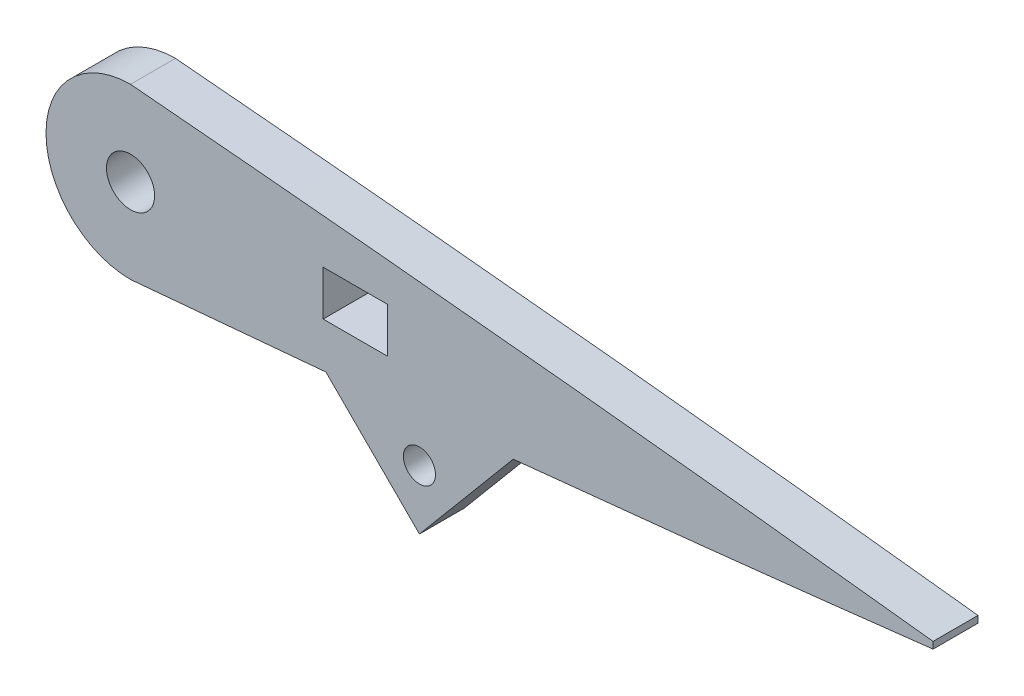
ISO-10303-21;
HEADER;
FILE_DESCRIPTION(('STEP AP214'),'2;1');
FILE_NAME('part.step','',(''),(''),'','','');
FILE_SCHEMA(('AUTOMOTIVE_DESIGN { 1 0 10303 214 1 1 1 1 }'));
ENDSEC;
DATA;
#1=APPLICATION_CONTEXT('core data for automotive mechanical design processes');
#2=APPLICATION_PROTOCOL_DEFINITION('international standard','automotive_design',2000,#1);
#3=PRODUCT_CONTEXT('',#1,'mechanical');
#4=PRODUCT('Part','Part','',(#3));
#5=PRODUCT_RELATED_PRODUCT_CATEGORY('part','',(#4));
#6=PRODUCT_DEFINITION_FORMATION('','',#4);
#7=PRODUCT_DEFINITION_CONTEXT('part definition',#1,'design');
#8=PRODUCT_DEFINITION('design','',#6,#7);
#9=PRODUCT_DEFINITION_SHAPE('','',#8);
#10=(LENGTH_UNIT() NAMED_UNIT(*) SI_UNIT(.MILLI.,.METRE.));
#11=(NAMED_UNIT(*) PLANE_ANGLE_UNIT() SI_UNIT($,.RADIAN.));
#12=(NAMED_UNIT(*) SI_UNIT($,.STERADIAN.) SOLID_ANGLE_UNIT());
#13=UNCERTAINTY_MEASURE_WITH_UNIT(LENGTH_MEASURE(1.E-05),#10,'distance_accuracy_value','');
#14=(GEOMETRIC_REPRESENTATION_CONTEXT(3) GLOBAL_UNCERTAINTY_ASSIGNED_CONTEXT((#13)) GLOBAL_UNIT_ASSIGNED_CONTEXT((#10,
#11,#12)) REPRESENTATION_CONTEXT('',''));
#15=CARTESIAN_POINT('',(0.,0.,0.));
#16=DIRECTION('',(0.,0.,1.));
#17=DIRECTION('',(1.,0.,0.));
#18=AXIS2_PLACEMENT_3D('',#15,#16,#17);
#19=CARTESIAN_POINT('',(103.510485688962,-86.8556103645885,1.4));
#20=DIRECTION('',(-0.766044443118982,0.642787609686535,0.));
#21=DIRECTION('',(-0.642787609686535,-0.766044443118982,0.));
#22=AXIS2_PLACEMENT_3D('',#19,#20,#21);
#23=PLANE('',#22);
#24=DIRECTION('',(0.642787609686535,0.766044443118982,0.));
#25=VECTOR('',#24,1.);
#26=CARTESIAN_POINT('',(103.510485688962,-86.8556103645885,-1.4));
#27=LINE('',#26,#25);
#28=CARTESIAN_POINT('',(167.999999999793,-9.99999999999999,-1.4));
#29=VERTEX_POINT('',#28);
#30=CARTESIAN_POINT('',(173.839461144014,-3.0408012025597,-1.4));
#31=VERTEX_POINT('',#30);
#32=EDGE_CURVE('E269',#29,#31,#27,.T.);
#33=ORIENTED_EDGE('',*,*,#32,.T.);
#34=DIRECTION('',(0.,0.,-1.));
#35=VECTOR('',#34,1.);
#36=CARTESIAN_POINT('',(173.839461144014,-3.0408012025597,1.4));
#37=LINE('',#36,#35);
#38=CARTESIAN_POINT('',(173.839461144014,-3.0408012025597,1.4));
#39=VERTEX_POINT('',#38);
#40=EDGE_CURVE('E11',#39,#31,#37,.T.);
#41=ORIENTED_EDGE('',*,*,#40,.F.);
#42=DIRECTION('',(0.642787609686535,0.766044443118982,0.));
#43=VECTOR('',#42,1.);
#44=CARTESIAN_POINT('',(103.510485688962,-86.8556103645885,1.4));
#45=LINE('',#44,#43);
#46=CARTESIAN_POINT('',(167.999999999793,-9.99999999999999,1.4));
#47=VERTEX_POINT('',#46);
#48=EDGE_CURVE('E204',#47,#39,#45,.T.);
#49=ORIENTED_EDGE('',*,*,#48,.F.);
#50=DIRECTION('',(0.,0.,-1.));
#51=VECTOR('',#50,1.);
#52=CARTESIAN_POINT('',(167.999999999793,-9.99999999999999,1.4));
#53=LINE('',#52,#51);
#54=EDGE_CURVE('E306',#47,#29,#53,.T.);
#55=ORIENTED_EDGE('',*,*,#54,.T.);
#56=EDGE_LOOP('',(#33,#41,#49,#55));
#57=FACE_BOUND('',#56,.T.);
#58=ADVANCED_FACE('F41',(#57),#23,.F.);
#59=CARTESIAN_POINT('',(0.,0.,1.4));
#60=CARTESIAN_POINT('',(0.032444912785252,-0.278495811932672,1.4));
#61=CARTESIAN_POINT('',(0.100633197622265,-0.863800259371728,1.4));
#62=CARTESIAN_POINT('',(0.623792519502603,-1.67890559775423,1.4));
#63=CARTESIAN_POINT('',(1.40745451828777,-2.44535909768092,1.4));
#64=CARTESIAN_POINT('',(2.48215990999626,-3.17800751475483,1.4));
#65=CARTESIAN_POINT('',(3.83151572514316,-3.88154027980952,1.4));
#66=CARTESIAN_POINT('',(5.4563996703271,-4.55654172443833,1.4));
#67=CARTESIAN_POINT('',(7.35019505624769,-5.20163810131563,1.4));
#68=CARTESIAN_POINT('',(9.50742603844495,-5.81478546001263,1.4));
#69=CARTESIAN_POINT('',(11.9213051192179,-6.39387938375779,1.4));
#70=CARTESIAN_POINT('',(14.5848929101615,-6.93661243110209,1.4));
#71=CARTESIAN_POINT('',(17.4908774412382,-7.44078362046572,1.4));
#72=CARTESIAN_POINT('',(20.6317189277736,-7.90429451896973,1.4));
#73=CARTESIAN_POINT('',(23.999672571568,-8.32520507104545,1.4));
#74=CARTESIAN_POINT('',(27.5867798768591,-8.70174184542543,1.4));
#75=CARTESIAN_POINT('',(31.3848698966528,-9.03247593180038,1.4));
#76=CARTESIAN_POINT('',(35.3855806534432,-9.31609287396642,1.4));
#77=CARTESIAN_POINT('',(39.5803132923038,-9.55173595460592,1.4));
#78=CARTESIAN_POINT('',(43.9602634342418,-9.73880703158846,1.4));
#79=CARTESIAN_POINT('',(48.5163740297902,-9.87706597159685,1.4));
#80=CARTESIAN_POINT('',(53.2393408892924,-9.96650447988356,1.4));
#81=CARTESIAN_POINT('',(58.1195804749707,-10.007674079145,1.4));
#82=CARTESIAN_POINT('',(63.1472322990156,-10.001179646896,1.4));
#83=CARTESIAN_POINT('',(68.3121128519377,-9.94818077935783,1.4));
#84=CARTESIAN_POINT('',(73.6037062020649,-9.8499841929222,1.4));
#85=CARTESIAN_POINT('',(79.0111217778761,-9.70818550815225,1.4));
#86=CARTESIAN_POINT('',(84.523090509599,-9.52465705063052,1.4));
#87=CARTESIAN_POINT('',(90.1278825022712,-9.30143328572871,1.4));
#88=CARTESIAN_POINT('',(95.8133076165863,-9.04071110478476,1.4));
#89=CARTESIAN_POINT('',(101.566628902932,-8.7448298081215,1.4));
#90=CARTESIAN_POINT('',(107.374551667041,-8.41626692508818,1.4));
#91=CARTESIAN_POINT('',(113.22310934854,-8.05749764662533,1.4));
#92=CARTESIAN_POINT('',(119.097620697921,-7.67114629363284,1.4));
#93=CARTESIAN_POINT('',(124.982562689731,-7.25984067879183,1.4));
#94=CARTESIAN_POINT('',(130.861479372453,-6.82616997050118,1.4));
#95=CARTESIAN_POINT('',(136.716836604175,-6.37289207616603,1.4));
#96=CARTESIAN_POINT('',(142.529855650017,-5.90276600308212,1.4));
#97=CARTESIAN_POINT('',(148.280267016593,-5.41860205745455,1.4));
#98=CARTESIAN_POINT('',(153.946093309733,-4.92342664586893,1.4));
#99=CARTESIAN_POINT('',(159.503224244657,-4.42043747597675,1.4));
#100=CARTESIAN_POINT('',(164.924982484319,-3.91321825677237,1.4));
#101=CARTESIAN_POINT('',(170.181418839819,-3.40569757505764,1.4));
#102=CARTESIAN_POINT('',(175.238405484524,-2.90257427967232,1.4));
#103=CARTESIAN_POINT('',(180.056168680252,-2.40924306336166,1.4));
#104=CARTESIAN_POINT('',(184.587045719794,-1.9324791813071,1.4));
#105=CARTESIAN_POINT('',(188.771568450786,-1.48069518196539,1.4));
#106=CARTESIAN_POINT('',(192.53078468655,-1.06506384171922,1.4));
#107=CARTESIAN_POINT('',(195.747560943775,-0.701689978749802,1.4));
#108=CARTESIAN_POINT('',(198.179524953216,-0.422303953934671,1.4));
#109=CARTESIAN_POINT('',(199.520051416084,-0.265971644451139,1.4));
#110=CARTESIAN_POINT('',(200.,-0.21,1.4));
#111=B_SPLINE_CURVE_WITH_KNOTS('',3,(#59,#60,#61,#62,#63,#64,#65,#66,#67,#68,#69,#70,#71,#72,
#73,#74,#75,#76,#77,#78,#79,#80,#81,#82,#83,#84,#85,#86,#87,#88,#89,#90,#91,#92,#93,#94,#95,#96,
#97,#98,#99,#100,#101,#102,#103,#104,#105,#106,#107,#108,#109,#110),.UNSPECIFIED.,.F.,.F.,(4,1,
1,1,1,1,1,1,1,1,1,1,1,1,1,1,1,1,1,1,1,1,1,1,1,1,1,1,1,1,1,1,1,1,1,1,1,1,1,1,1,1,1,1,1,1,1,1,1,
4),(0.,0.00409901119627068,0.00861474169622246,0.013934854724959,0.0202777746115639,
0.0277529807018305,0.0364102145151919,0.0462664329749759,0.057320237837208,0.0695589461393541,
0.0829628608595683,0.0975072182865541,0.113164081930894,0.129902689855954,0.147690303906216,
0.166492184642367,0.186271967143026,0.206991861424857,0.228612214931178,0.25109216492606,
0.274388983443375,0.298458209116087,0.323253842050884,0.348727970896163,0.374830386774719,
0.401509190431855,0.428710015672103,0.456376153594157,0.484448082863221,0.512863886613239,
0.541558094079446,0.570462312854758,0.599504247573885,0.628607348748546,0.657690446050344,
0.68666723740018,0.715444848929875,0.743923546361862,0.771994829811623,0.799540252867686,
0.826428321931678,0.852512114582347,0.877624445997917,0.901571133904992,0.924121062493777,
0.944988816236939,0.963803938777258,0.980044339265456,0.992855276358985,1.),.UNSPECIFIED.);
#112=DIRECTION('',(0.,0.,-1.));
#113=VECTOR('',#112,1.);
#114=SURFACE_OF_LINEAR_EXTRUSION('',#111,#113);
#115=CARTESIAN_POINT('',(0.,0.,-1.4));
#116=CARTESIAN_POINT('',(0.032444912785252,-0.278495811932672,-1.4));
#117=CARTESIAN_POINT('',(0.100633197622265,-0.863800259371728,-1.4));
#118=CARTESIAN_POINT('',(0.623792519502603,-1.67890559775423,-1.4));
#119=CARTESIAN_POINT('',(1.40745451828777,-2.44535909768092,-1.4));
#120=CARTESIAN_POINT('',(2.48215990999626,-3.17800751475483,-1.4));
#121=CARTESIAN_POINT('',(3.83151572514316,-3.88154027980952,-1.4));
#122=CARTESIAN_POINT('',(5.4563996703271,-4.55654172443833,-1.4));
#123=CARTESIAN_POINT('',(7.35019505624769,-5.20163810131563,-1.4));
#124=CARTESIAN_POINT('',(9.50742603844495,-5.81478546001263,-1.4));
#125=CARTESIAN_POINT('',(11.9213051192179,-6.39387938375779,-1.4));
#126=CARTESIAN_POINT('',(14.5848929101615,-6.93661243110209,-1.4));
#127=CARTESIAN_POINT('',(17.4908774412382,-7.44078362046572,-1.4));
#128=CARTESIAN_POINT('',(20.6317189277736,-7.90429451896973,-1.4));
#129=CARTESIAN_POINT('',(23.999672571568,-8.32520507104545,-1.4));
#130=CARTESIAN_POINT('',(27.5867798768591,-8.70174184542543,-1.4));
#131=CARTESIAN_POINT('',(31.3848698966528,-9.03247593180038,-1.4));
#132=CARTESIAN_POINT('',(35.3855806534432,-9.31609287396642,-1.4));
#133=CARTESIAN_POINT('',(39.5803132923038,-9.55173595460592,-1.4));
#134=CARTESIAN_POINT('',(43.9602634342418,-9.73880703158846,-1.4));
#135=CARTESIAN_POINT('',(48.5163740297902,-9.87706597159685,-1.4));
#136=CARTESIAN_POINT('',(53.2393408892924,-9.96650447988356,-1.4));
#137=CARTESIAN_POINT('',(58.1195804749707,-10.007674079145,-1.4));
#138=CARTESIAN_POINT('',(63.1472322990156,-10.001179646896,-1.4));
#139=CARTESIAN_POINT('',(68.3121128519377,-9.94818077935783,-1.4));
#140=CARTESIAN_POINT('',(73.6037062020649,-9.8499841929222,-1.4));
#141=CARTESIAN_POINT('',(79.0111217778761,-9.70818550815225,-1.4));
#142=CARTESIAN_POINT('',(84.523090509599,-9.52465705063052,-1.4));
#143=CARTESIAN_POINT('',(90.1278825022712,-9.30143328572871,-1.4));
#144=CARTESIAN_POINT('',(95.8133076165863,-9.04071110478476,-1.4));
#145=CARTESIAN_POINT('',(101.566628902932,-8.7448298081215,-1.4));
#146=CARTESIAN_POINT('',(107.374551667041,-8.41626692508818,-1.4));
#147=CARTESIAN_POINT('',(113.22310934854,-8.05749764662533,-1.4));
#148=CARTESIAN_POINT('',(119.097620697921,-7.67114629363284,-1.4));
#149=CARTESIAN_POINT('',(124.982562689731,-7.25984067879183,-1.4));
#150=CARTESIAN_POINT('',(130.861479372453,-6.82616997050118,-1.4));
#151=CARTESIAN_POINT('',(136.716836604175,-6.37289207616603,-1.4));
#152=CARTESIAN_POINT('',(142.529855650017,-5.90276600308212,-1.4));
#153=CARTESIAN_POINT('',(148.280267016593,-5.41860205745455,-1.4));
#154=CARTESIAN_POINT('',(153.946093309733,-4.92342664586893,-1.4));
#155=CARTESIAN_POINT('',(159.503224244657,-4.42043747597675,-1.4));
#156=CARTESIAN_POINT('',(164.924982484319,-3.91321825677237,-1.4));
#157=CARTESIAN_POINT('',(170.181418839819,-3.40569757505764,-1.4));
#158=CARTESIAN_POINT('',(175.238405484524,-2.90257427967232,-1.4));
#159=CARTESIAN_POINT('',(180.056168680252,-2.40924306336166,-1.4));
#160=CARTESIAN_POINT('',(184.587045719794,-1.9324791813071,-1.4));
#161=CARTESIAN_POINT('',(188.771568450786,-1.48069518196539,-1.4));
#162=CARTESIAN_POINT('',(192.53078468655,-1.06506384171922,-1.4));
#163=CARTESIAN_POINT('',(195.747560943775,-0.701689978749802,-1.4));
#164=CARTESIAN_POINT('',(198.179524953216,-0.422303953934671,-1.4));
#165=CARTESIAN_POINT('',(199.520051416084,-0.265971644451139,-1.4));
#166=CARTESIAN_POINT('',(200.,-0.21,-1.4));
#167=B_SPLINE_CURVE_WITH_KNOTS('',3,(#115,#116,#117,#118,#119,#120,#121,#122,#123,#124,#125,
#126,#127,#128,#129,#130,#131,#132,#133,#134,#135,#136,#137,#138,#139,#140,#141,#142,#143,#144,
#145,#146,#147,#148,#149,#150,#151,#152,#153,#154,#155,#156,#157,#158,#159,#160,#161,#162,#163,
#164,#165,#166),.UNSPECIFIED.,.F.,.F.,(4,1,1,1,1,1,1,1,1,1,1,1,1,1,1,1,1,1,1,1,1,1,1,1,1,1,1,1,
1,1,1,1,1,1,1,1,1,1,1,1,1,1,1,1,1,1,1,1,1,4),(0.,0.00409901119627068,0.00861474169622246,
0.013934854724959,0.0202777746115639,0.0277529807018305,0.0364102145151919,0.0462664329749759,
0.057320237837208,0.0695589461393541,0.0829628608595683,0.0975072182865541,0.113164081930894,
0.129902689855954,0.147690303906216,0.166492184642367,0.186271967143026,0.206991861424857,
0.228612214931178,0.25109216492606,0.274388983443375,0.298458209116087,0.323253842050884,
0.348727970896163,0.374830386774719,0.401509190431855,0.428710015672103,0.456376153594157,
0.484448082863221,0.512863886613239,0.541558094079446,0.570462312854758,0.599504247573885,
0.628607348748546,0.657690446050344,0.68666723740018,0.715444848929875,0.743923546361862,
0.771994829811623,0.799540252867686,0.826428321931678,0.852512114582347,0.877624445997917,
0.901571133904992,0.924121062493777,0.944988816236939,0.963803938777258,0.980044339265456,
0.992855276358985,1.),.UNSPECIFIED.);
#168=CARTESIAN_POINT('',(200.,-0.21,-1.4));
#169=VERTEX_POINT('',#168);
#170=EDGE_CURVE('E273',#31,#169,#167,.T.);
#171=ORIENTED_EDGE('',*,*,#170,.T.);
#172=DIRECTION('',(0.,0.,-1.));
#173=VECTOR('',#172,1.);
#174=CARTESIAN_POINT('',(200.,-0.21,1.4));
#175=LINE('',#174,#173);
#176=CARTESIAN_POINT('',(200.,-0.21,1.4));
#177=VERTEX_POINT('',#176);
#178=EDGE_CURVE('E52',#177,#169,#175,.T.);
#179=ORIENTED_EDGE('',*,*,#178,.F.);
#180=EDGE_CURVE('E198',#39,#177,#111,.T.);
#181=ORIENTED_EDGE('',*,*,#180,.F.);
#182=ORIENTED_EDGE('',*,*,#40,.T.);
#183=EDGE_LOOP('',(#171,#179,#181,#182));
#184=FACE_BOUND('',#183,.T.);
#185=ADVANCED_FACE('F209',(#184),#114,.F.);
#186=CARTESIAN_POINT('',(200.,0.,1.4));
#187=DIRECTION('',(1.,0.,0.));
#188=DIRECTION('',(0.,0.,-1.));
#189=AXIS2_PLACEMENT_3D('',#186,#187,#188);
#190=PLANE('',#189);
#191=DIRECTION('',(0.,-1.,0.));
#192=VECTOR('',#191,1.);
#193=CARTESIAN_POINT('',(200.,0.,-1.4));
#194=LINE('',#193,#192);
#195=CARTESIAN_POINT('',(200.,0.21,-1.4));
#196=VERTEX_POINT('',#195);
#197=EDGE_CURVE('E279',#196,#169,#194,.T.);
#198=ORIENTED_EDGE('',*,*,#197,.F.);
#199=DIRECTION('',(0.,0.,-1.));
#200=VECTOR('',#199,1.);
#201=CARTESIAN_POINT('',(200.,0.21,1.4));
#202=LINE('',#201,#200);
#203=CARTESIAN_POINT('',(200.,0.21,1.4));
#204=VERTEX_POINT('',#203);
#205=EDGE_CURVE('E313',#204,#196,#202,.T.);
#206=ORIENTED_EDGE('',*,*,#205,.F.);
#207=DIRECTION('',(0.,-1.,0.));
#208=VECTOR('',#207,1.);
#209=CARTESIAN_POINT('',(200.,0.,1.4));
#210=LINE('',#209,#208);
#211=EDGE_CURVE('E191',#204,#177,#210,.T.);
#212=ORIENTED_EDGE('',*,*,#211,.T.);
#213=ORIENTED_EDGE('',*,*,#178,.T.);
#214=EDGE_LOOP('',(#198,#206,#212,#213));
#215=FACE_BOUND('',#214,.T.);
#216=ADVANCED_FACE('F183',(#215),#190,.T.);
#217=CARTESIAN_POINT('',(200.,0.21,1.4));
#218=CARTESIAN_POINT('',(199.520051416084,0.265971644451139,1.4));
#219=CARTESIAN_POINT('',(198.179524953216,0.42230395393467,1.4));
#220=CARTESIAN_POINT('',(195.747560943775,0.701689978749802,1.4));
#221=CARTESIAN_POINT('',(192.53078468655,1.06506384171923,1.4));
#222=CARTESIAN_POINT('',(188.771568450786,1.48069518196539,1.4));
#223=CARTESIAN_POINT('',(184.587045719794,1.9324791813071,1.4));
#224=CARTESIAN_POINT('',(180.056168680252,2.40924306336166,1.4));
#225=CARTESIAN_POINT('',(175.238405484524,2.90257427967232,1.4));
#226=CARTESIAN_POINT('',(170.181418839819,3.40569757505764,1.4));
#227=CARTESIAN_POINT('',(164.924982484319,3.91321825677237,1.4));
#228=CARTESIAN_POINT('',(159.503224244657,4.42043747597675,1.4));
#229=CARTESIAN_POINT('',(153.946093309733,4.92342664586893,1.4));
#230=CARTESIAN_POINT('',(148.280267016593,5.41860205745455,1.4));
#231=CARTESIAN_POINT('',(142.529855650017,5.90276600308212,1.4));
#232=CARTESIAN_POINT('',(136.716836604175,6.37289207616603,1.4));
#233=CARTESIAN_POINT('',(130.861479372453,6.82616997050118,1.4));
#234=CARTESIAN_POINT('',(124.982562689731,7.25984067879183,1.4));
#235=CARTESIAN_POINT('',(119.097620697921,7.67114629363284,1.4));
#236=CARTESIAN_POINT('',(113.22310934854,8.05749764662533,1.4));
#237=CARTESIAN_POINT('',(107.374551667041,8.41626692508818,1.4));
#238=CARTESIAN_POINT('',(101.566628902932,8.74482980812151,1.4));
#239=CARTESIAN_POINT('',(95.8133076165863,9.04071110478476,1.4));
#240=CARTESIAN_POINT('',(90.1278825022712,9.30143328572872,1.4));
#241=CARTESIAN_POINT('',(84.5230905095989,9.52465705063052,1.4));
#242=CARTESIAN_POINT('',(79.011121777876,9.70818550815226,1.4));
#243=CARTESIAN_POINT('',(73.603706202065,9.8499841929222,1.4));
#244=CARTESIAN_POINT('',(68.3121128519377,9.94818077935784,1.4));
#245=CARTESIAN_POINT('',(63.1472322990156,10.001179646896,1.4));
#246=CARTESIAN_POINT('',(58.1195804749707,10.007674079145,1.4));
#247=CARTESIAN_POINT('',(53.2393408892924,9.96650447988356,1.4));
#248=CARTESIAN_POINT('',(48.5163740297902,9.87706597159685,1.4));
#249=CARTESIAN_POINT('',(43.9602634342419,9.73880703158846,1.4));
#250=CARTESIAN_POINT('',(39.5803132923038,9.55173595460593,1.4));
#251=CARTESIAN_POINT('',(35.3855806534432,9.31609287396642,1.4));
#252=CARTESIAN_POINT('',(31.3848698966529,9.03247593180038,1.4));
#253=CARTESIAN_POINT('',(27.5867798768591,8.70174184542543,1.4));
#254=CARTESIAN_POINT('',(23.999672571568,8.32520507104544,1.4));
#255=CARTESIAN_POINT('',(20.6317189277736,7.90429451896974,1.4));
#256=CARTESIAN_POINT('',(17.4908774412382,7.44078362046572,1.4));
#257=CARTESIAN_POINT('',(14.5848929101615,6.93661243110209,1.4));
#258=CARTESIAN_POINT('',(11.9213051192179,6.39387938375778,1.4));
#259=CARTESIAN_POINT('',(9.50742603844498,5.81478546001263,1.4));
#260=CARTESIAN_POINT('',(7.35019505624767,5.20163810131563,1.4));
#261=CARTESIAN_POINT('',(5.4563996703271,4.55654172443833,1.4));
#262=CARTESIAN_POINT('',(3.83151572514316,3.88154027980952,1.4));
#263=CARTESIAN_POINT('',(2.48215990999627,3.17800751475484,1.4));
#264=CARTESIAN_POINT('',(1.40745451828776,2.44535909768091,1.4));
#265=CARTESIAN_POINT('',(0.623792519502604,1.67890559775423,1.4));
#266=CARTESIAN_POINT('',(0.100633197622267,0.863800259371733,1.4));
#267=CARTESIAN_POINT('',(0.0324449127852523,0.278495811932672,1.4));
#268=CARTESIAN_POINT('',(0.,0.,1.4));
#269=B_SPLINE_CURVE_WITH_KNOTS('',3,(#217,#218,#219,#220,#221,#222,#223,#224,#225,#226,#227,
#228,#229,#230,#231,#232,#233,#234,#235,#236,#237,#238,#239,#240,#241,#242,#243,#244,#245,#246,
#247,#248,#249,#250,#251,#252,#253,#254,#255,#256,#257,#258,#259,#260,#261,#262,#263,#264,#265,
#266,#267,#268),.UNSPECIFIED.,.F.,.F.,(4,1,1,1,1,1,1,1,1,1,1,1,1,1,1,1,1,1,1,1,1,1,1,1,1,1,1,1,
1,1,1,1,1,1,1,1,1,1,1,1,1,1,1,1,1,1,1,1,1,4),(0.,0.00714472364101506,0.0199556607345444,
0.0361960612227424,0.0550111837630615,0.075878937506223,0.0984288660950082,0.122375554002083,
0.147487885417653,0.173571678068322,0.200459747132314,0.228005170188377,0.256076453638138,
0.284555151070125,0.31333276259982,0.342309553949656,0.371392651251454,0.400495752426115,
0.429537687145242,0.458441905920554,0.487136113386761,0.515551917136779,0.543623846405843,
0.571289984327897,0.598490809568145,0.625169613225281,0.651272029103836,0.676746157949116,
0.701541790883912,0.725611016556625,0.74890783507394,0.771387785068822,0.793008138575142,
0.813728032856974,0.833507815357633,0.852309696093784,0.870097310144046,0.886835918069106,
0.902492781713446,0.917037139140432,0.930441053860646,0.942679762162792,0.953733567025024,
0.963589785484808,0.972247019298169,0.979722225388436,0.986065145275041,0.991385258303777,
0.995900988803729,1.),.UNSPECIFIED.);
#270=DIRECTION('',(0.,0.,-1.));
#271=VECTOR('',#270,1.);
#272=SURFACE_OF_LINEAR_EXTRUSION('',#269,#271);
#273=CARTESIAN_POINT('',(200.,0.21,-1.4));
#274=CARTESIAN_POINT('',(199.520051416084,0.265971644451139,-1.4));
#275=CARTESIAN_POINT('',(198.179524953216,0.42230395393467,-1.4));
#276=CARTESIAN_POINT('',(195.747560943775,0.701689978749802,-1.4));
#277=CARTESIAN_POINT('',(192.53078468655,1.06506384171923,-1.4));
#278=CARTESIAN_POINT('',(188.771568450786,1.48069518196539,-1.4));
#279=CARTESIAN_POINT('',(184.587045719794,1.9324791813071,-1.4));
#280=CARTESIAN_POINT('',(180.056168680252,2.40924306336166,-1.4));
#281=CARTESIAN_POINT('',(175.238405484524,2.90257427967232,-1.4));
#282=CARTESIAN_POINT('',(170.181418839819,3.40569757505764,-1.4));
#283=CARTESIAN_POINT('',(164.924982484319,3.91321825677237,-1.4));
#284=CARTESIAN_POINT('',(159.503224244657,4.42043747597675,-1.4));
#285=CARTESIAN_POINT('',(153.946093309733,4.92342664586893,-1.4));
#286=CARTESIAN_POINT('',(148.280267016593,5.41860205745455,-1.4));
#287=CARTESIAN_POINT('',(142.529855650017,5.90276600308212,-1.4));
#288=CARTESIAN_POINT('',(136.716836604175,6.37289207616603,-1.4));
#289=CARTESIAN_POINT('',(130.861479372453,6.82616997050118,-1.4));
#290=CARTESIAN_POINT('',(124.982562689731,7.25984067879183,-1.4));
#291=CARTESIAN_POINT('',(119.097620697921,7.67114629363284,-1.4));
#292=CARTESIAN_POINT('',(113.22310934854,8.05749764662533,-1.4));
#293=CARTESIAN_POINT('',(107.374551667041,8.41626692508818,-1.4));
#294=CARTESIAN_POINT('',(101.566628902932,8.74482980812151,-1.4));
#295=CARTESIAN_POINT('',(95.8133076165863,9.04071110478476,-1.4));
#296=CARTESIAN_POINT('',(90.1278825022712,9.30143328572872,-1.4));
#297=CARTESIAN_POINT('',(84.5230905095989,9.52465705063052,-1.4));
#298=CARTESIAN_POINT('',(79.011121777876,9.70818550815226,-1.4));
#299=CARTESIAN_POINT('',(73.603706202065,9.8499841929222,-1.4));
#300=CARTESIAN_POINT('',(68.3121128519377,9.94818077935784,-1.4));
#301=CARTESIAN_POINT('',(63.1472322990156,10.001179646896,-1.4));
#302=CARTESIAN_POINT('',(58.1195804749707,10.007674079145,-1.4));
#303=CARTESIAN_POINT('',(53.2393408892924,9.96650447988356,-1.4));
#304=CARTESIAN_POINT('',(48.5163740297902,9.87706597159685,-1.4));
#305=CARTESIAN_POINT('',(43.9602634342419,9.73880703158846,-1.4));
#306=CARTESIAN_POINT('',(39.5803132923038,9.55173595460593,-1.4));
#307=CARTESIAN_POINT('',(35.3855806534432,9.31609287396642,-1.4));
#308=CARTESIAN_POINT('',(31.3848698966529,9.03247593180038,-1.4));
#309=CARTESIAN_POINT('',(27.5867798768591,8.70174184542543,-1.4));
#310=CARTESIAN_POINT('',(23.999672571568,8.32520507104544,-1.4));
#311=CARTESIAN_POINT('',(20.6317189277736,7.90429451896974,-1.4));
#312=CARTESIAN_POINT('',(17.4908774412382,7.44078362046572,-1.4));
#313=CARTESIAN_POINT('',(14.5848929101615,6.93661243110209,-1.4));
#314=CARTESIAN_POINT('',(11.9213051192179,6.39387938375778,-1.4));
#315=CARTESIAN_POINT('',(9.50742603844498,5.81478546001263,-1.4));
#316=CARTESIAN_POINT('',(7.35019505624767,5.20163810131563,-1.4));
#317=CARTESIAN_POINT('',(5.4563996703271,4.55654172443833,-1.4));
#318=CARTESIAN_POINT('',(3.83151572514316,3.88154027980952,-1.4));
#319=CARTESIAN_POINT('',(2.48215990999627,3.17800751475484,-1.4));
#320=CARTESIAN_POINT('',(1.40745451828776,2.44535909768091,-1.4));
#321=CARTESIAN_POINT('',(0.623792519502604,1.67890559775423,-1.4));
#322=CARTESIAN_POINT('',(0.100633197622267,0.863800259371733,-1.4));
#323=CARTESIAN_POINT('',(0.0324449127852523,0.278495811932672,-1.4));
#324=CARTESIAN_POINT('',(0.,0.,-1.4));
#325=B_SPLINE_CURVE_WITH_KNOTS('',3,(#273,#274,#275,#276,#277,#278,#279,#280,#281,#282,#283,
#284,#285,#286,#287,#288,#289,#290,#291,#292,#293,#294,#295,#296,#297,#298,#299,#300,#301,#302,
#303,#304,#305,#306,#307,#308,#309,#310,#311,#312,#313,#314,#315,#316,#317,#318,#319,#320,#321,
#322,#323,#324),.UNSPECIFIED.,.F.,.F.,(4,1,1,1,1,1,1,1,1,1,1,1,1,1,1,1,1,1,1,1,1,1,1,1,1,1,1,1,
1,1,1,1,1,1,1,1,1,1,1,1,1,1,1,1,1,1,1,1,1,4),(0.,0.00714472364101506,0.0199556607345444,
0.0361960612227424,0.0550111837630615,0.075878937506223,0.0984288660950082,0.122375554002083,
0.147487885417653,0.173571678068322,0.200459747132314,0.228005170188377,0.256076453638138,
0.284555151070125,0.31333276259982,0.342309553949656,0.371392651251454,0.400495752426115,
0.429537687145242,0.458441905920554,0.487136113386761,0.515551917136779,0.543623846405843,
0.571289984327897,0.598490809568145,0.625169613225281,0.651272029103836,0.676746157949116,
0.701541790883912,0.725611016556625,0.74890783507394,0.771387785068822,0.793008138575142,
0.813728032856974,0.833507815357633,0.852309696093784,0.870097310144046,0.886835918069106,
0.902492781713446,0.917037139140432,0.930441053860646,0.942679762162792,0.953733567025024,
0.963589785484808,0.972247019298169,0.979722225388436,0.986065145275041,0.991385258303777,
0.995900988803729,1.),.UNSPECIFIED.);
#326=CARTESIAN_POINT('',(149.999999999793,5.26718539787095,-1.4));
#327=VERTEX_POINT('',#326);
#328=EDGE_CURVE('E286',#196,#327,#325,.T.);
#329=ORIENTED_EDGE('',*,*,#328,.T.);
#330=DIRECTION('',(0.,0.,-1.));
#331=VECTOR('',#330,1.);
#332=CARTESIAN_POINT('',(149.999999999793,5.26718539787095,1.4));
#333=LINE('',#332,#331);
#334=CARTESIAN_POINT('',(149.999999999793,5.26718539787095,1.4));
#335=VERTEX_POINT('',#334);
#336=EDGE_CURVE('E155',#335,#327,#333,.T.);
#337=ORIENTED_EDGE('',*,*,#336,.F.);
#338=EDGE_CURVE('E144',#204,#335,#269,.T.);
#339=ORIENTED_EDGE('',*,*,#338,.F.);
#340=ORIENTED_EDGE('',*,*,#205,.T.);
#341=EDGE_LOOP('',(#329,#337,#339,#340));
#342=FACE_BOUND('',#341,.T.);
#343=ADVANCED_FACE('F180',(#342),#272,.F.);
#344=CARTESIAN_POINT('',(149.999999999793,0.,1.4));
#345=DIRECTION('',(0.,0.,-1.));
#346=DIRECTION('',(-1.,0.,0.));
#347=AXIS2_PLACEMENT_3D('',#344,#345,#346);
#348=CYLINDRICAL_SURFACE('',#347,5.26718539787095);
#349=CARTESIAN_POINT('',(149.999999999793,0.,-1.4));
#350=DIRECTION('',(0.,0.,1.));
#351=DIRECTION('',(1.,0.,0.));
#352=AXIS2_PLACEMENT_3D('',#349,#350,#351);
#353=CIRCLE('',#352,5.26718539787095);
#354=CARTESIAN_POINT('',(149.999999999793,-5.26718539787095,-1.4));
#355=VERTEX_POINT('',#354);
#356=EDGE_CURVE('E153',#327,#355,#353,.T.);
#357=ORIENTED_EDGE('',*,*,#356,.T.);
#358=DIRECTION('',(0.,0.,-1.));
#359=VECTOR('',#358,1.);
#360=CARTESIAN_POINT('',(149.999999999793,-5.26718539787095,1.4));
#361=LINE('',#360,#359);
#362=CARTESIAN_POINT('',(149.999999999793,-5.26718539787095,1.4));
#363=VERTEX_POINT('',#362);
#364=EDGE_CURVE('E150',#363,#355,#361,.T.);
#365=ORIENTED_EDGE('',*,*,#364,.F.);
#366=CARTESIAN_POINT('',(149.999999999793,0.,1.4));
#367=DIRECTION('',(0.,0.,1.));
#368=DIRECTION('',(1.,0.,0.));
#369=AXIS2_PLACEMENT_3D('',#366,#367,#368);
#370=CIRCLE('',#369,5.26718539787095);
#371=EDGE_CURVE('E137',#335,#363,#370,.T.);
#372=ORIENTED_EDGE('',*,*,#371,.F.);
#373=ORIENTED_EDGE('',*,*,#336,.T.);
#374=EDGE_LOOP('',(#357,#365,#372,#373));
#375=FACE_BOUND('',#374,.T.);
#376=ADVANCED_FACE('F151',(#375),#348,.T.);
#377=CARTESIAN_POINT('',(0.,0.,1.4));
#378=CARTESIAN_POINT('',(0.032444912785252,-0.278495811932672,1.4));
#379=CARTESIAN_POINT('',(0.100633197622265,-0.863800259371728,1.4));
#380=CARTESIAN_POINT('',(0.623792519502603,-1.67890559775423,1.4));
#381=CARTESIAN_POINT('',(1.40745451828777,-2.44535909768092,1.4));
#382=CARTESIAN_POINT('',(2.48215990999626,-3.17800751475483,1.4));
#383=CARTESIAN_POINT('',(3.83151572514316,-3.88154027980952,1.4));
#384=CARTESIAN_POINT('',(5.4563996703271,-4.55654172443833,1.4));
#385=CARTESIAN_POINT('',(7.35019505624769,-5.20163810131563,1.4));
#386=CARTESIAN_POINT('',(9.50742603844495,-5.81478546001263,1.4));
#387=CARTESIAN_POINT('',(11.9213051192179,-6.39387938375779,1.4));
#388=CARTESIAN_POINT('',(14.5848929101615,-6.93661243110209,1.4));
#389=CARTESIAN_POINT('',(17.4908774412382,-7.44078362046572,1.4));
#390=CARTESIAN_POINT('',(20.6317189277736,-7.90429451896973,1.4));
#391=CARTESIAN_POINT('',(23.999672571568,-8.32520507104545,1.4));
#392=CARTESIAN_POINT('',(27.5867798768591,-8.70174184542543,1.4));
#393=CARTESIAN_POINT('',(31.3848698966528,-9.03247593180038,1.4));
#394=CARTESIAN_POINT('',(35.3855806534432,-9.31609287396642,1.4));
#395=CARTESIAN_POINT('',(39.5803132923038,-9.55173595460592,1.4));
#396=CARTESIAN_POINT('',(43.9602634342418,-9.73880703158846,1.4));
#397=CARTESIAN_POINT('',(48.5163740297902,-9.87706597159685,1.4));
#398=CARTESIAN_POINT('',(53.2393408892924,-9.96650447988356,1.4));
#399=CARTESIAN_POINT('',(58.1195804749707,-10.007674079145,1.4));
#400=CARTESIAN_POINT('',(63.1472322990156,-10.001179646896,1.4));
#401=CARTESIAN_POINT('',(68.3121128519377,-9.94818077935783,1.4));
#402=CARTESIAN_POINT('',(73.6037062020649,-9.8499841929222,1.4));
#403=CARTESIAN_POINT('',(79.0111217778761,-9.70818550815225,1.4));
#404=CARTESIAN_POINT('',(84.523090509599,-9.52465705063052,1.4));
#405=CARTESIAN_POINT('',(90.1278825022712,-9.30143328572871,1.4));
#406=CARTESIAN_POINT('',(95.8133076165863,-9.04071110478476,1.4));
#407=CARTESIAN_POINT('',(101.566628902932,-8.7448298081215,1.4));
#408=CARTESIAN_POINT('',(107.374551667041,-8.41626692508818,1.4));
#409=CARTESIAN_POINT('',(113.22310934854,-8.05749764662533,1.4));
#410=CARTESIAN_POINT('',(119.097620697921,-7.67114629363284,1.4));
#411=CARTESIAN_POINT('',(124.982562689731,-7.25984067879183,1.4));
#412=CARTESIAN_POINT('',(130.861479372453,-6.82616997050118,1.4));
#413=CARTESIAN_POINT('',(136.716836604175,-6.37289207616603,1.4));
#414=CARTESIAN_POINT('',(142.529855650017,-5.90276600308212,1.4));
#415=CARTESIAN_POINT('',(148.280267016593,-5.41860205745455,1.4));
#416=CARTESIAN_POINT('',(153.946093309733,-4.92342664586893,1.4));
#417=CARTESIAN_POINT('',(159.503224244657,-4.42043747597675,1.4));
#418=CARTESIAN_POINT('',(164.924982484319,-3.91321825677237,1.4));
#419=CARTESIAN_POINT('',(170.181418839819,-3.40569757505764,1.4));
#420=CARTESIAN_POINT('',(175.238405484524,-2.90257427967232,1.4));
#421=CARTESIAN_POINT('',(180.056168680252,-2.40924306336166,1.4));
#422=CARTESIAN_POINT('',(184.587045719794,-1.9324791813071,1.4));
#423=CARTESIAN_POINT('',(188.771568450786,-1.48069518196539,1.4));
#424=CARTESIAN_POINT('',(192.53078468655,-1.06506384171922,1.4));
#425=CARTESIAN_POINT('',(195.747560943775,-0.701689978749802,1.4));
#426=CARTESIAN_POINT('',(198.179524953216,-0.422303953934671,1.4));
#427=CARTESIAN_POINT('',(199.520051416084,-0.265971644451139,1.4));
#428=CARTESIAN_POINT('',(200.,-0.21,1.4));
#429=B_SPLINE_CURVE_WITH_KNOTS('',3,(#377,#378,#379,#380,#381,#382,#383,#384,#385,#386,#387,
#388,#389,#390,#391,#392,#393,#394,#395,#396,#397,#398,#399,#400,#401,#402,#403,#404,#405,#406,
#407,#408,#409,#410,#411,#412,#413,#414,#415,#416,#417,#418,#419,#420,#421,#422,#423,#424,#425,
#426,#427,#428),.UNSPECIFIED.,.F.,.F.,(4,1,1,1,1,1,1,1,1,1,1,1,1,1,1,1,1,1,1,1,1,1,1,1,1,1,1,1,
1,1,1,1,1,1,1,1,1,1,1,1,1,1,1,1,1,1,1,1,1,4),(0.,0.00409901119627068,0.00861474169622246,
0.013934854724959,0.0202777746115639,0.0277529807018305,0.0364102145151919,0.0462664329749759,
0.057320237837208,0.0695589461393541,0.0829628608595683,0.0975072182865541,0.113164081930894,
0.129902689855954,0.147690303906216,0.166492184642367,0.186271967143026,0.206991861424857,
0.228612214931178,0.25109216492606,0.274388983443375,0.298458209116087,0.323253842050884,
0.348727970896163,0.374830386774719,0.401509190431855,0.428710015672103,0.456376153594157,
0.484448082863221,0.512863886613239,0.541558094079446,0.570462312854758,0.599504247573885,
0.628607348748546,0.657690446050344,0.68666723740018,0.715444848929875,0.743923546361862,
0.771994829811623,0.799540252867686,0.826428321931678,0.852512114582347,0.877624445997917,
0.901571133904992,0.924121062493777,0.944988816236939,0.963803938777258,0.980044339265456,
0.992855276358985,1.),.UNSPECIFIED.);
#430=DIRECTION('',(0.,0.,-1.));
#431=VECTOR('',#430,1.);
#432=SURFACE_OF_LINEAR_EXTRUSION('',#429,#431);
#433=CARTESIAN_POINT('',(0.,0.,-1.4));
#434=CARTESIAN_POINT('',(0.032444912785252,-0.278495811932672,-1.4));
#435=CARTESIAN_POINT('',(0.100633197622265,-0.863800259371728,-1.4));
#436=CARTESIAN_POINT('',(0.623792519502603,-1.67890559775423,-1.4));
#437=CARTESIAN_POINT('',(1.40745451828777,-2.44535909768092,-1.4));
#438=CARTESIAN_POINT('',(2.48215990999626,-3.17800751475483,-1.4));
#439=CARTESIAN_POINT('',(3.83151572514316,-3.88154027980952,-1.4));
#440=CARTESIAN_POINT('',(5.4563996703271,-4.55654172443833,-1.4));
#441=CARTESIAN_POINT('',(7.35019505624769,-5.20163810131563,-1.4));
#442=CARTESIAN_POINT('',(9.50742603844495,-5.81478546001263,-1.4));
#443=CARTESIAN_POINT('',(11.9213051192179,-6.39387938375779,-1.4));
#444=CARTESIAN_POINT('',(14.5848929101615,-6.93661243110209,-1.4));
#445=CARTESIAN_POINT('',(17.4908774412382,-7.44078362046572,-1.4));
#446=CARTESIAN_POINT('',(20.6317189277736,-7.90429451896973,-1.4));
#447=CARTESIAN_POINT('',(23.999672571568,-8.32520507104545,-1.4));
#448=CARTESIAN_POINT('',(27.5867798768591,-8.70174184542543,-1.4));
#449=CARTESIAN_POINT('',(31.3848698966528,-9.03247593180038,-1.4));
#450=CARTESIAN_POINT('',(35.3855806534432,-9.31609287396642,-1.4));
#451=CARTESIAN_POINT('',(39.5803132923038,-9.55173595460592,-1.4));
#452=CARTESIAN_POINT('',(43.9602634342418,-9.73880703158846,-1.4));
#453=CARTESIAN_POINT('',(48.5163740297902,-9.87706597159685,-1.4));
#454=CARTESIAN_POINT('',(53.2393408892924,-9.96650447988356,-1.4));
#455=CARTESIAN_POINT('',(58.1195804749707,-10.007674079145,-1.4));
#456=CARTESIAN_POINT('',(63.1472322990156,-10.001179646896,-1.4));
#457=CARTESIAN_POINT('',(68.3121128519377,-9.94818077935783,-1.4));
#458=CARTESIAN_POINT('',(73.6037062020649,-9.8499841929222,-1.4));
#459=CARTESIAN_POINT('',(79.0111217778761,-9.70818550815225,-1.4));
#460=CARTESIAN_POINT('',(84.523090509599,-9.52465705063052,-1.4));
#461=CARTESIAN_POINT('',(90.1278825022712,-9.30143328572871,-1.4));
#462=CARTESIAN_POINT('',(95.8133076165863,-9.04071110478476,-1.4));
#463=CARTESIAN_POINT('',(101.566628902932,-8.7448298081215,-1.4));
#464=CARTESIAN_POINT('',(107.374551667041,-8.41626692508818,-1.4));
#465=CARTESIAN_POINT('',(113.22310934854,-8.05749764662533,-1.4));
#466=CARTESIAN_POINT('',(119.097620697921,-7.67114629363284,-1.4));
#467=CARTESIAN_POINT('',(124.982562689731,-7.25984067879183,-1.4));
#468=CARTESIAN_POINT('',(130.861479372453,-6.82616997050118,-1.4));
#469=CARTESIAN_POINT('',(136.716836604175,-6.37289207616603,-1.4));
#470=CARTESIAN_POINT('',(142.529855650017,-5.90276600308212,-1.4));
#471=CARTESIAN_POINT('',(148.280267016593,-5.41860205745455,-1.4));
#472=CARTESIAN_POINT('',(153.946093309733,-4.92342664586893,-1.4));
#473=CARTESIAN_POINT('',(159.503224244657,-4.42043747597675,-1.4));
#474=CARTESIAN_POINT('',(164.924982484319,-3.91321825677237,-1.4));
#475=CARTESIAN_POINT('',(170.181418839819,-3.40569757505764,-1.4));
#476=CARTESIAN_POINT('',(175.238405484524,-2.90257427967232,-1.4));
#477=CARTESIAN_POINT('',(180.056168680252,-2.40924306336166,-1.4));
#478=CARTESIAN_POINT('',(184.587045719794,-1.9324791813071,-1.4));
#479=CARTESIAN_POINT('',(188.771568450786,-1.48069518196539,-1.4));
#480=CARTESIAN_POINT('',(192.53078468655,-1.06506384171922,-1.4));
#481=CARTESIAN_POINT('',(195.747560943775,-0.701689978749802,-1.4));
#482=CARTESIAN_POINT('',(198.179524953216,-0.422303953934671,-1.4));
#483=CARTESIAN_POINT('',(199.520051416084,-0.265971644451139,-1.4));
#484=CARTESIAN_POINT('',(200.,-0.21,-1.4));
#485=B_SPLINE_CURVE_WITH_KNOTS('',3,(#433,#434,#435,#436,#437,#438,#439,#440,#441,#442,#443,
#444,#445,#446,#447,#448,#449,#450,#451,#452,#453,#454,#455,#456,#457,#458,#459,#460,#461,#462,
#463,#464,#465,#466,#467,#468,#469,#470,#471,#472,#473,#474,#475,#476,#477,#478,#479,#480,#481,
#482,#483,#484),.UNSPECIFIED.,.F.,.F.,(4,1,1,1,1,1,1,1,1,1,1,1,1,1,1,1,1,1,1,1,1,1,1,1,1,1,1,1,
1,1,1,1,1,1,1,1,1,1,1,1,1,1,1,1,1,1,1,1,1,4),(0.,0.00409901119627068,0.00861474169622246,
0.013934854724959,0.0202777746115639,0.0277529807018305,0.0364102145151919,0.0462664329749759,
0.057320237837208,0.0695589461393541,0.0829628608595683,0.0975072182865541,0.113164081930894,
0.129902689855954,0.147690303906216,0.166492184642367,0.186271967143026,0.206991861424857,
0.228612214931178,0.25109216492606,0.274388983443375,0.298458209116087,0.323253842050884,
0.348727970896163,0.374830386774719,0.401509190431855,0.428710015672103,0.456376153594157,
0.484448082863221,0.512863886613239,0.541558094079446,0.570462312854758,0.599504247573885,
0.628607348748546,0.657690446050344,0.68666723740018,0.715444848929875,0.743923546361862,
0.771994829811623,0.799540252867686,0.826428321931678,0.852512114582347,0.877624445997917,
0.901571133904992,0.924121062493777,0.944988816236939,0.963803938777258,0.980044339265456,
0.992855276358985,1.),.UNSPECIFIED.);
#486=CARTESIAN_POINT('',(162.170244805681,-4.17024480588789,-1.4));
#487=VERTEX_POINT('',#486);
#488=EDGE_CURVE('E99',#355,#487,#485,.T.);
#489=ORIENTED_EDGE('',*,*,#488,.T.);
#490=DIRECTION('',(0.,0.,-1.));
#491=VECTOR('',#490,1.);
#492=CARTESIAN_POINT('',(162.170244805681,-4.17024480588789,1.4));
#493=LINE('',#492,#491);
#494=CARTESIAN_POINT('',(162.170244805681,-4.17024480588789,1.4));
#495=VERTEX_POINT('',#494);
#496=EDGE_CURVE('E156',#495,#487,#493,.T.);
#497=ORIENTED_EDGE('',*,*,#496,.F.);
#498=EDGE_CURVE('E141',#363,#495,#429,.T.);
#499=ORIENTED_EDGE('',*,*,#498,.F.);
#500=ORIENTED_EDGE('',*,*,#364,.T.);
#501=EDGE_LOOP('',(#489,#497,#499,#500));
#502=FACE_BOUND('',#501,.T.);
#503=ADVANCED_FACE('F158',(#502),#432,.F.);
#504=CARTESIAN_POINT('',(0.,1.4,1.4));
#505=DIRECTION('',(0.,1.,0.));
#506=DIRECTION('',(0.,0.,1.));
#507=AXIS2_PLACEMENT_3D('',#504,#505,#506);
#508=PLANE('',#507);
#509=DIRECTION('',(1.,0.,0.));
#510=VECTOR('',#509,1.);
#511=CARTESIAN_POINT('',(0.,1.4,-1.4));
#512=LINE('',#511,#510);
#513=CARTESIAN_POINT('',(161.999999999793,1.4,-1.4));
#514=VERTEX_POINT('',#513);
#515=CARTESIAN_POINT('',(165.999999999793,1.4,-1.4));
#516=VERTEX_POINT('',#515);
#517=EDGE_CURVE('E248',#514,#516,#512,.T.);
#518=ORIENTED_EDGE('',*,*,#517,.T.);
#519=DIRECTION('',(0.,0.,-1.));
#520=VECTOR('',#519,1.);
#521=CARTESIAN_POINT('',(165.999999999793,1.4,1.4));
#522=LINE('',#521,#520);
#523=CARTESIAN_POINT('',(165.999999999793,1.4,1.4));
#524=VERTEX_POINT('',#523);
#525=EDGE_CURVE('E45',#524,#516,#522,.T.);
#526=ORIENTED_EDGE('',*,*,#525,.F.);
#527=DIRECTION('',(1.,0.,0.));
#528=VECTOR('',#527,1.);
#529=CARTESIAN_POINT('',(0.,1.4,1.4));
#530=LINE('',#529,#528);
#531=CARTESIAN_POINT('',(161.999999999793,1.4,1.4));
#532=VERTEX_POINT('',#531);
#533=EDGE_CURVE('E305',#532,#524,#530,.T.);
#534=ORIENTED_EDGE('',*,*,#533,.F.);
#535=DIRECTION('',(0.,0.,-1.));
#536=VECTOR('',#535,1.);
#537=CARTESIAN_POINT('',(161.999999999793,1.4,1.4));
#538=LINE('',#537,#536);
#539=EDGE_CURVE('E162',#532,#514,#538,.T.);
#540=ORIENTED_EDGE('',*,*,#539,.T.);
#541=EDGE_LOOP('',(#518,#526,#534,#540));
#542=FACE_BOUND('',#541,.T.);
#543=ADVANCED_FACE('F43',(#542),#508,.F.);
#544=CARTESIAN_POINT('',(165.999999999793,0.,1.4));
#545=DIRECTION('',(1.,0.,0.));
#546=DIRECTION('',(0.,0.,-1.));
#547=AXIS2_PLACEMENT_3D('',#544,#545,#546);
#548=PLANE('',#547);
#549=DIRECTION('',(0.,-1.,0.));
#550=VECTOR('',#549,1.);
#551=CARTESIAN_POINT('',(165.999999999793,0.,-1.4));
#552=LINE('',#551,#550);
#553=CARTESIAN_POINT('',(165.999999999793,-1.4,-1.4));
#554=VERTEX_POINT('',#553);
#555=EDGE_CURVE('E238',#516,#554,#552,.T.);
#556=ORIENTED_EDGE('',*,*,#555,.T.);
#557=DIRECTION('',(0.,0.,-1.));
#558=VECTOR('',#557,1.);
#559=CARTESIAN_POINT('',(165.999999999793,-1.4,1.4));
#560=LINE('',#559,#558);
#561=CARTESIAN_POINT('',(165.999999999793,-1.4,1.4));
#562=VERTEX_POINT('',#561);
#563=EDGE_CURVE('E240',#562,#554,#560,.T.);
#564=ORIENTED_EDGE('',*,*,#563,.F.);
#565=DIRECTION('',(0.,-1.,0.));
#566=VECTOR('',#565,1.);
#567=CARTESIAN_POINT('',(165.999999999793,0.,1.4));
#568=LINE('',#567,#566);
#569=EDGE_CURVE('E114',#524,#562,#568,.T.);
#570=ORIENTED_EDGE('',*,*,#569,.F.);
#571=ORIENTED_EDGE('',*,*,#525,.T.);
#572=EDGE_LOOP('',(#556,#564,#570,#571));
#573=FACE_BOUND('',#572,.T.);
#574=ADVANCED_FACE('F230',(#573),#548,.F.);
#575=CARTESIAN_POINT('',(0.,-1.4,1.4));
#576=DIRECTION('',(0.,1.,0.));
#577=DIRECTION('',(0.,0.,1.));
#578=AXIS2_PLACEMENT_3D('',#575,#576,#577);
#579=PLANE('',#578);
#580=DIRECTION('',(1.,0.,0.));
#581=VECTOR('',#580,1.);
#582=CARTESIAN_POINT('',(0.,-1.4,-1.4));
#583=LINE('',#582,#581);
#584=CARTESIAN_POINT('',(161.999999999793,-1.4,-1.4));
#585=VERTEX_POINT('',#584);
#586=EDGE_CURVE('E247',#585,#554,#583,.T.);
#587=ORIENTED_EDGE('',*,*,#586,.F.);
#588=DIRECTION('',(0.,0.,-1.));
#589=VECTOR('',#588,1.);
#590=CARTESIAN_POINT('',(161.999999999793,-1.4,1.4));
#591=LINE('',#590,#589);
#592=CARTESIAN_POINT('',(161.999999999793,-1.4,1.4));
#593=VERTEX_POINT('',#592);
#594=EDGE_CURVE('E320',#593,#585,#591,.T.);
#595=ORIENTED_EDGE('',*,*,#594,.F.);
#596=DIRECTION('',(1.,0.,0.));
#597=VECTOR('',#596,1.);
#598=CARTESIAN_POINT('',(0.,-1.4,1.4));
#599=LINE('',#598,#597);
#600=EDGE_CURVE('E325',#593,#562,#599,.T.);
#601=ORIENTED_EDGE('',*,*,#600,.T.);
#602=ORIENTED_EDGE('',*,*,#563,.T.);
#603=EDGE_LOOP('',(#587,#595,#601,#602));
#604=FACE_BOUND('',#603,.T.);
#605=ADVANCED_FACE('F220',(#604),#579,.T.);
#606=CARTESIAN_POINT('',(167.999999999793,-6.3,1.4));
#607=DIRECTION('',(0.,0.,-1.));
#608=DIRECTION('',(-1.,0.,0.));
#609=AXIS2_PLACEMENT_3D('',#606,#607,#608);
#610=CYLINDRICAL_SURFACE('',#609,0.999999999999998);
#611=CARTESIAN_POINT('',(167.999999999793,-6.3,1.4));
#612=DIRECTION('',(0.,0.,1.));
#613=DIRECTION('',(1.,0.,0.));
#614=AXIS2_PLACEMENT_3D('',#611,#612,#613);
#615=CIRCLE('',#614,0.999999999999998);
#616=CARTESIAN_POINT('',(168.999999999793,-6.3,1.4));
#617=VERTEX_POINT('',#616);
#618=EDGE_CURVE('E341',#617,#617,#615,.T.);
#619=ORIENTED_EDGE('',*,*,#618,.T.);
#620=EDGE_LOOP('',(#619));
#621=FACE_BOUND('',#620,.T.);
#622=CARTESIAN_POINT('',(167.999999999793,-6.3,-1.4));
#623=DIRECTION('',(0.,0.,1.));
#624=DIRECTION('',(1.,0.,0.));
#625=AXIS2_PLACEMENT_3D('',#622,#623,#624);
#626=CIRCLE('',#625,0.999999999999998);
#627=CARTESIAN_POINT('',(168.999999999793,-6.3,-1.4));
#628=VERTEX_POINT('',#627);
#629=EDGE_CURVE('E265',#628,#628,#626,.T.);
#630=ORIENTED_EDGE('',*,*,#629,.F.);
#631=EDGE_LOOP('',(#630));
#632=FACE_BOUND('',#631,.T.);
#633=ADVANCED_FACE('F216',(#621,#632),#610,.F.);
#634=CARTESIAN_POINT('',(149.999999999793,0.,1.4));
#635=DIRECTION('',(0.,0.,-1.));
#636=DIRECTION('',(-1.,0.,0.));
#637=AXIS2_PLACEMENT_3D('',#634,#635,#636);
#638=CYLINDRICAL_SURFACE('',#637,1.5);
#639=CARTESIAN_POINT('',(149.999999999793,0.,1.4));
#640=DIRECTION('',(0.,0.,1.));
#641=DIRECTION('',(1.,0.,0.));
#642=AXIS2_PLACEMENT_3D('',#639,#640,#641);
#643=CIRCLE('',#642,1.5);
#644=CARTESIAN_POINT('',(151.499999999793,0.,1.4));
#645=VERTEX_POINT('',#644);
#646=EDGE_CURVE('E334',#645,#645,#643,.T.);
#647=ORIENTED_EDGE('',*,*,#646,.T.);
#648=EDGE_LOOP('',(#647));
#649=FACE_BOUND('',#648,.T.);
#650=CARTESIAN_POINT('',(149.999999999793,0.,-1.4));
#651=DIRECTION('',(0.,0.,1.));
#652=DIRECTION('',(1.,0.,0.));
#653=AXIS2_PLACEMENT_3D('',#650,#651,#652);
#654=CIRCLE('',#653,1.5);
#655=CARTESIAN_POINT('',(151.499999999793,0.,-1.4));
#656=VERTEX_POINT('',#655);
#657=EDGE_CURVE('E259',#656,#656,#654,.T.);
#658=ORIENTED_EDGE('',*,*,#657,.F.);
#659=EDGE_LOOP('',(#658));
#660=FACE_BOUND('',#659,.T.);
#661=ADVANCED_FACE('F219',(#649,#660),#638,.F.);
#662=CARTESIAN_POINT('',(161.999999999793,0.,1.4));
#663=DIRECTION('',(1.,0.,0.));
#664=DIRECTION('',(0.,0.,-1.));
#665=AXIS2_PLACEMENT_3D('',#662,#663,#664);
#666=PLANE('',#665);
#667=DIRECTION('',(0.,-1.,0.));
#668=VECTOR('',#667,1.);
#669=CARTESIAN_POINT('',(161.999999999793,0.,-1.4));
#670=LINE('',#669,#668);
#671=EDGE_CURVE('E255',#514,#585,#670,.T.);
#672=ORIENTED_EDGE('',*,*,#671,.F.);
#673=ORIENTED_EDGE('',*,*,#539,.F.);
#674=DIRECTION('',(0.,-1.,0.));
#675=VECTOR('',#674,1.);
#676=CARTESIAN_POINT('',(161.999999999793,0.,1.4));
#677=LINE('',#676,#675);
#678=EDGE_CURVE('E330',#532,#593,#677,.T.);
#679=ORIENTED_EDGE('',*,*,#678,.T.);
#680=ORIENTED_EDGE('',*,*,#594,.T.);
#681=EDGE_LOOP('',(#672,#673,#679,#680));
#682=FACE_BOUND('',#681,.T.);
#683=ADVANCED_FACE('F224',(#682),#666,.T.);
#684=CARTESIAN_POINT('',(78.9999999998964,78.9999999998963,1.4));
#685=DIRECTION('',(0.707106781186548,0.707106781186547,0.));
#686=DIRECTION('',(-0.707106781186547,0.707106781186548,0.));
#687=AXIS2_PLACEMENT_3D('',#684,#685,#686);
#688=PLANE('',#687);
#689=DIRECTION('',(0.707106781186547,-0.707106781186548,0.));
#690=VECTOR('',#689,1.);
#691=CARTESIAN_POINT('',(78.9999999998964,78.9999999998963,-1.4));
#692=LINE('',#691,#690);
#693=EDGE_CURVE('E105',#487,#29,#692,.T.);
#694=ORIENTED_EDGE('',*,*,#693,.T.);
#695=ORIENTED_EDGE('',*,*,#54,.F.);
#696=DIRECTION('',(0.707106781186547,-0.707106781186548,0.));
#697=VECTOR('',#696,1.);
#698=CARTESIAN_POINT('',(78.9999999998964,78.9999999998963,1.4));
#699=LINE('',#698,#697);
#700=EDGE_CURVE('E61',#495,#47,#699,.T.);
#701=ORIENTED_EDGE('',*,*,#700,.F.);
#702=ORIENTED_EDGE('',*,*,#496,.T.);
#703=EDGE_LOOP('',(#694,#695,#701,#702));
#704=FACE_BOUND('',#703,.T.);
#705=ADVANCED_FACE('F176',(#704),#688,.F.);
#706=CARTESIAN_POINT('',(0.,0.,1.4));
#707=DIRECTION('',(0.,0.,1.));
#708=DIRECTION('',(1.,0.,0.));
#709=AXIS2_PLACEMENT_3D('',#706,#707,#708);
#710=PLANE('',#709);
#711=ORIENTED_EDGE('',*,*,#533,.T.);
#712=ORIENTED_EDGE('',*,*,#569,.T.);
#713=ORIENTED_EDGE('',*,*,#600,.F.);
#714=ORIENTED_EDGE('',*,*,#678,.F.);
#715=EDGE_LOOP('',(#711,#712,#713,#714));
#716=FACE_BOUND('',#715,.T.);
#717=ORIENTED_EDGE('',*,*,#646,.F.);
#718=EDGE_LOOP('',(#717));
#719=FACE_BOUND('',#718,.T.);
#720=ORIENTED_EDGE('',*,*,#618,.F.);
#721=EDGE_LOOP('',(#720));
#722=FACE_BOUND('',#721,.T.);
#723=ORIENTED_EDGE('',*,*,#48,.T.);
#724=ORIENTED_EDGE('',*,*,#180,.T.);
#725=ORIENTED_EDGE('',*,*,#211,.F.);
#726=ORIENTED_EDGE('',*,*,#338,.T.);
#727=ORIENTED_EDGE('',*,*,#371,.T.);
#728=ORIENTED_EDGE('',*,*,#498,.T.);
#729=ORIENTED_EDGE('',*,*,#700,.T.);
#730=EDGE_LOOP('',(#723,#724,#725,#726,#727,#728,#729));
#731=FACE_BOUND('',#730,.T.);
#732=ADVANCED_FACE('F139',(#716,#719,#722,#731),#710,.T.);
#733=CARTESIAN_POINT('',(0.,0.,-1.4));
#734=DIRECTION('',(0.,0.,1.));
#735=DIRECTION('',(1.,0.,0.));
#736=AXIS2_PLACEMENT_3D('',#733,#734,#735);
#737=PLANE('',#736);
#738=ORIENTED_EDGE('',*,*,#517,.F.);
#739=ORIENTED_EDGE('',*,*,#671,.T.);
#740=ORIENTED_EDGE('',*,*,#586,.T.);
#741=ORIENTED_EDGE('',*,*,#555,.F.);
#742=EDGE_LOOP('',(#738,#739,#740,#741));
#743=FACE_BOUND('',#742,.T.);
#744=ORIENTED_EDGE('',*,*,#657,.T.);
#745=EDGE_LOOP('',(#744));
#746=FACE_BOUND('',#745,.T.);
#747=ORIENTED_EDGE('',*,*,#629,.T.);
#748=EDGE_LOOP('',(#747));
#749=FACE_BOUND('',#748,.T.);
#750=ORIENTED_EDGE('',*,*,#32,.F.);
#751=ORIENTED_EDGE('',*,*,#693,.F.);
#752=ORIENTED_EDGE('',*,*,#488,.F.);
#753=ORIENTED_EDGE('',*,*,#356,.F.);
#754=ORIENTED_EDGE('',*,*,#328,.F.);
#755=ORIENTED_EDGE('',*,*,#197,.T.);
#756=ORIENTED_EDGE('',*,*,#170,.F.);
#757=EDGE_LOOP('',(#750,#751,#752,#753,#754,#755,#756));
#758=FACE_BOUND('',#757,.T.);
#759=ADVANCED_FACE('F252',(#743,#746,#749,#758),#737,.F.);
#760=CLOSED_SHELL('',(#58,#185,#216,#343,#376,#503,#543,#574,#605,#633,#661,#683,#705,#732,#759));
#761=MANIFOLD_SOLID_BREP('B2',#760);
#762=ADVANCED_BREP_SHAPE_REPRESENTATION('',(#18,#761),#14);
#763=SHAPE_DEFINITION_REPRESENTATION(#9,#762);
ENDSEC;
END-ISO-10303-21;
